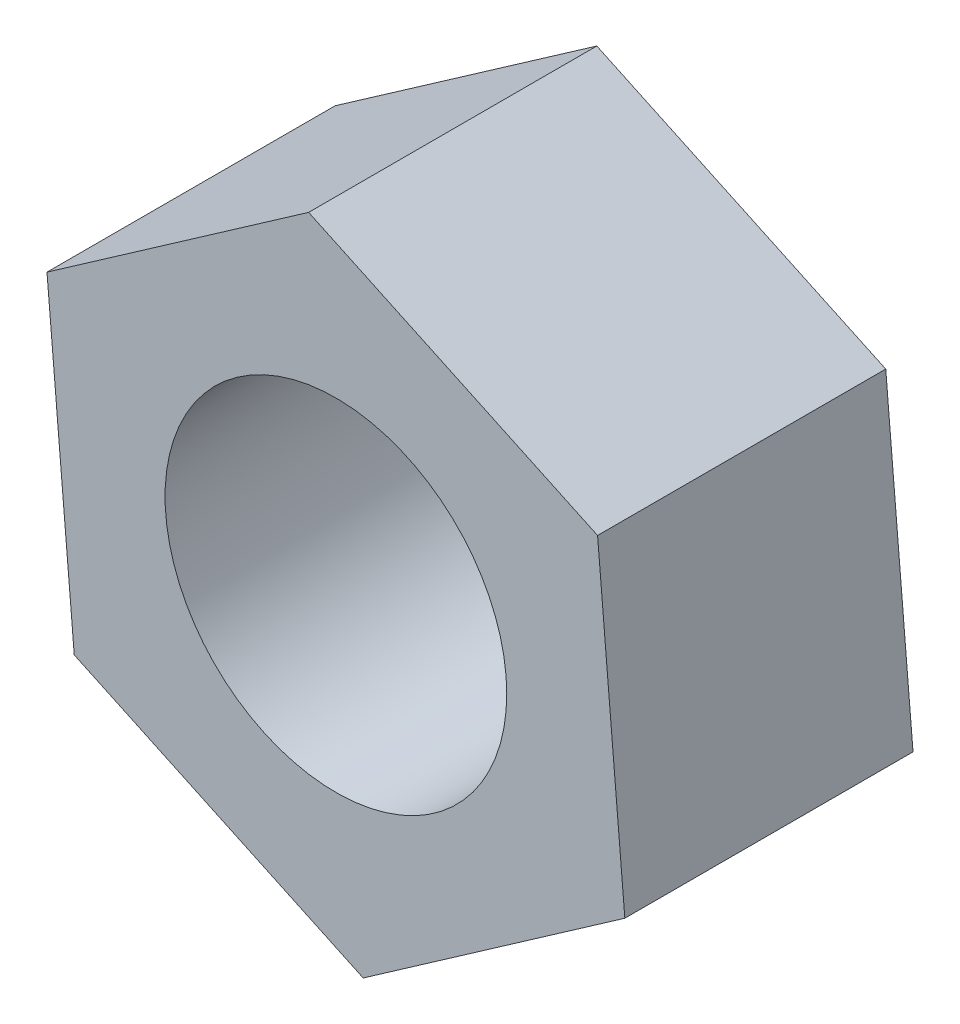
ISO-10303-21;
HEADER;
FILE_DESCRIPTION(('STEP AP214'),'2;1');
FILE_NAME('part.step','',(''),(''),'','','');
FILE_SCHEMA(('AUTOMOTIVE_DESIGN { 1 0 10303 214 1 1 1 1 }'));
ENDSEC;
DATA;
#1=APPLICATION_CONTEXT('core data for automotive mechanical design processes');
#2=APPLICATION_PROTOCOL_DEFINITION('international standard','automotive_design',2000,#1);
#3=PRODUCT_CONTEXT('',#1,'mechanical');
#4=PRODUCT('Part','Part','',(#3));
#5=PRODUCT_RELATED_PRODUCT_CATEGORY('part','',(#4));
#6=PRODUCT_DEFINITION_FORMATION('','',#4);
#7=PRODUCT_DEFINITION_CONTEXT('part definition',#1,'design');
#8=PRODUCT_DEFINITION('design','',#6,#7);
#9=PRODUCT_DEFINITION_SHAPE('','',#8);
#10=(LENGTH_UNIT() NAMED_UNIT(*) SI_UNIT(.MILLI.,.METRE.));
#11=(NAMED_UNIT(*) PLANE_ANGLE_UNIT() SI_UNIT($,.RADIAN.));
#12=(NAMED_UNIT(*) SI_UNIT($,.STERADIAN.) SOLID_ANGLE_UNIT());
#13=UNCERTAINTY_MEASURE_WITH_UNIT(LENGTH_MEASURE(1.E-05),#10,'distance_accuracy_value','');
#14=(GEOMETRIC_REPRESENTATION_CONTEXT(3) GLOBAL_UNCERTAINTY_ASSIGNED_CONTEXT((#13)) GLOBAL_UNIT_ASSIGNED_CONTEXT((#10,
#11,#12)) REPRESENTATION_CONTEXT('',''));
#15=CARTESIAN_POINT('',(0.,0.,0.));
#16=DIRECTION('',(0.,0.,1.));
#17=DIRECTION('',(1.,0.,0.));
#18=AXIS2_PLACEMENT_3D('',#15,#16,#17);
#19=CARTESIAN_POINT('',(-63.1293214477623,-11.1289207444886,10.));
#20=DIRECTION('',(0.,0.,1.));
#21=DIRECTION('',(1.,0.,0.));
#22=AXIS2_PLACEMENT_3D('',#19,#20,#21);
#23=PLANE('',#22);
#24=CARTESIAN_POINT('',(-15.0674842298031,-32.9075500518083,10.));
#25=DIRECTION('',(0.,0.,1.));
#26=DIRECTION('',(1.,0.,0.));
#27=AXIS2_PLACEMENT_3D('',#24,#25,#26);
#28=CIRCLE('',#27,4.15);
#29=CARTESIAN_POINT('',(-10.9174842298031,-32.9075500518083,10.));
#30=VERTEX_POINT('',#29);
#31=EDGE_CURVE('E11',#30,#30,#28,.T.);
#32=ORIENTED_EDGE('',*,*,#31,.T.);
#33=EDGE_LOOP('',(#32));
#34=FACE_BOUND('',#33,.T.);
#35=DIRECTION('',(-0.0855136291043812,0.996337000837266,0.));
#36=VECTOR('',#35,1.);
#37=CARTESIAN_POINT('',(-8.19005950123517,-34.5509822121306,10.));
#38=LINE('',#37,#36);
#39=CARTESIAN_POINT('',(-8.04900697774375,-36.1944143724528,10.));
#40=VERTEX_POINT('',#39);
#41=CARTESIAN_POINT('',(-8.71173760330268,-28.4728026159639,10.));
#42=VERTEX_POINT('',#41);
#43=EDGE_CURVE('E99',#40,#42,#38,.T.);
#44=ORIENTED_EDGE('',*,*,#43,.F.);
#45=DIRECTION('',(0.820096338903279,0.572225475592828,0.));
#46=VECTOR('',#45,1.);
#47=CARTESIAN_POINT('',(-11.226880290994,-38.411788090375,10.));
#48=LINE('',#47,#46);
#49=CARTESIAN_POINT('',(-14.4047536042442,-40.6291618082971,10.));
#50=VERTEX_POINT('',#49);
#51=EDGE_CURVE('E47',#50,#40,#48,.T.);
#52=ORIENTED_EDGE('',*,*,#51,.F.);
#53=DIRECTION('',(0.90560996800766,-0.424111525244439,0.));
#54=VECTOR('',#53,1.);
#55=CARTESIAN_POINT('',(-17.9139922302738,-38.9857296479749,10.));
#56=LINE('',#55,#54);
#57=CARTESIAN_POINT('',(-21.4232308563035,-37.3422974876528,10.));
#58=VERTEX_POINT('',#57);
#59=EDGE_CURVE('E134',#58,#50,#56,.T.);
#60=ORIENTED_EDGE('',*,*,#59,.F.);
#61=DIRECTION('',(0.0855136291043807,-0.996337000837266,0.));
#62=VECTOR('',#61,1.);
#63=CARTESIAN_POINT('',(-21.6135436455915,-35.1249237697305,10.));
#64=LINE('',#63,#62);
#65=CARTESIAN_POINT('',(-22.0859614818625,-29.6206857311639,10.));
#66=VERTEX_POINT('',#65);
#67=EDGE_CURVE('E120',#66,#58,#64,.T.);
#68=ORIENTED_EDGE('',*,*,#67,.F.);
#69=DIRECTION('',(-0.82009633890328,-0.572225475592827,0.));
#70=VECTOR('',#69,1.);
#71=CARTESIAN_POINT('',(-18.9080881686122,-27.4033120132418,10.));
#72=LINE('',#71,#70);
#73=CARTESIAN_POINT('',(-15.7302148553621,-25.1859382953196,10.));
#74=VERTEX_POINT('',#73);
#75=EDGE_CURVE('E115',#74,#66,#72,.T.);
#76=ORIENTED_EDGE('',*,*,#75,.F.);
#77=DIRECTION('',(-0.90560996800766,0.424111525244439,0.));
#78=VECTOR('',#77,1.);
#79=CARTESIAN_POINT('',(-12.2209762293324,-26.8293704556418,10.));
#80=LINE('',#79,#78);
#81=EDGE_CURVE('E103',#42,#74,#80,.T.);
#82=ORIENTED_EDGE('',*,*,#81,.F.);
#83=EDGE_LOOP('',(#44,#52,#60,#68,#76,#82));
#84=FACE_BOUND('',#83,.T.);
#85=ADVANCED_FACE('F17',(#34,#84),#23,.F.);
#86=CARTESIAN_POINT('',(-63.1293214477623,-11.1289207444886,17.));
#87=DIRECTION('',(0.,0.,1.));
#88=DIRECTION('',(1.,0.,0.));
#89=AXIS2_PLACEMENT_3D('',#86,#87,#88);
#90=PLANE('',#89);
#91=CARTESIAN_POINT('',(-15.0674842298031,-32.9075500518083,17.));
#92=DIRECTION('',(0.,0.,1.));
#93=DIRECTION('',(1.,0.,0.));
#94=AXIS2_PLACEMENT_3D('',#91,#92,#93);
#95=CIRCLE('',#94,4.15);
#96=CARTESIAN_POINT('',(-10.9174842298031,-32.9075500518083,17.));
#97=VERTEX_POINT('',#96);
#98=EDGE_CURVE('E25',#97,#97,#95,.T.);
#99=ORIENTED_EDGE('',*,*,#98,.F.);
#100=EDGE_LOOP('',(#99));
#101=FACE_BOUND('',#100,.T.);
#102=DIRECTION('',(-0.0855136291043812,0.996337000837266,0.));
#103=VECTOR('',#102,1.);
#104=CARTESIAN_POINT('',(-8.19005950123517,-34.5509822121306,17.));
#105=LINE('',#104,#103);
#106=CARTESIAN_POINT('',(-8.04900697774375,-36.1944143724528,17.));
#107=VERTEX_POINT('',#106);
#108=CARTESIAN_POINT('',(-8.71173760330268,-28.4728026159639,17.));
#109=VERTEX_POINT('',#108);
#110=EDGE_CURVE('E101',#107,#109,#105,.T.);
#111=ORIENTED_EDGE('',*,*,#110,.T.);
#112=DIRECTION('',(-0.90560996800766,0.424111525244439,0.));
#113=VECTOR('',#112,1.);
#114=CARTESIAN_POINT('',(-12.2209762293324,-26.8293704556418,17.));
#115=LINE('',#114,#113);
#116=CARTESIAN_POINT('',(-15.7302148553621,-25.1859382953196,17.));
#117=VERTEX_POINT('',#116);
#118=EDGE_CURVE('E118',#109,#117,#115,.T.);
#119=ORIENTED_EDGE('',*,*,#118,.T.);
#120=DIRECTION('',(-0.82009633890328,-0.572225475592827,0.));
#121=VECTOR('',#120,1.);
#122=CARTESIAN_POINT('',(-18.9080881686122,-27.4033120132418,17.));
#123=LINE('',#122,#121);
#124=CARTESIAN_POINT('',(-22.0859614818625,-29.6206857311639,17.));
#125=VERTEX_POINT('',#124);
#126=EDGE_CURVE('E125',#117,#125,#123,.T.);
#127=ORIENTED_EDGE('',*,*,#126,.T.);
#128=DIRECTION('',(0.0855136291043807,-0.996337000837266,0.));
#129=VECTOR('',#128,1.);
#130=CARTESIAN_POINT('',(-21.6135436455915,-35.1249237697305,17.));
#131=LINE('',#130,#129);
#132=CARTESIAN_POINT('',(-21.4232308563035,-37.3422974876528,17.));
#133=VERTEX_POINT('',#132);
#134=EDGE_CURVE('E137',#125,#133,#131,.T.);
#135=ORIENTED_EDGE('',*,*,#134,.T.);
#136=DIRECTION('',(0.90560996800766,-0.424111525244439,0.));
#137=VECTOR('',#136,1.);
#138=CARTESIAN_POINT('',(-17.9139922302738,-38.9857296479749,17.));
#139=LINE('',#138,#137);
#140=CARTESIAN_POINT('',(-14.4047536042442,-40.6291618082971,17.));
#141=VERTEX_POINT('',#140);
#142=EDGE_CURVE('E93',#133,#141,#139,.T.);
#143=ORIENTED_EDGE('',*,*,#142,.T.);
#144=DIRECTION('',(0.820096338903279,0.572225475592828,0.));
#145=VECTOR('',#144,1.);
#146=CARTESIAN_POINT('',(-11.226880290994,-38.411788090375,17.));
#147=LINE('',#146,#145);
#148=EDGE_CURVE('E37',#141,#107,#147,.T.);
#149=ORIENTED_EDGE('',*,*,#148,.T.);
#150=EDGE_LOOP('',(#111,#119,#127,#135,#143,#149));
#151=FACE_BOUND('',#150,.T.);
#152=ADVANCED_FACE('F165',(#101,#151),#90,.T.);
#153=CARTESIAN_POINT('',(-15.0674842298031,-32.9075500518083,17.));
#154=DIRECTION('',(0.,0.,-1.));
#155=DIRECTION('',(-1.,0.,0.));
#156=AXIS2_PLACEMENT_3D('',#153,#154,#155);
#157=CYLINDRICAL_SURFACE('',#156,4.15);
#158=ORIENTED_EDGE('',*,*,#31,.F.);
#159=EDGE_LOOP('',(#158));
#160=FACE_BOUND('',#159,.T.);
#161=ORIENTED_EDGE('',*,*,#98,.T.);
#162=EDGE_LOOP('',(#161));
#163=FACE_BOUND('',#162,.T.);
#164=ADVANCED_FACE('F163',(#160,#163),#157,.F.);
#165=CARTESIAN_POINT('',(-11.226880290994,-38.411788090375,17.));
#166=DIRECTION('',(-0.572225475592827,0.82009633890328,0.));
#167=DIRECTION('',(0.,0.,1.));
#168=AXIS2_PLACEMENT_3D('',#165,#166,#167);
#169=PLANE('',#168);
#170=ORIENTED_EDGE('',*,*,#51,.T.);
#171=DIRECTION('',(0.,0.,-1.));
#172=VECTOR('',#171,1.);
#173=CARTESIAN_POINT('',(-8.04900697774375,-36.1944143724528,17.));
#174=LINE('',#173,#172);
#175=EDGE_CURVE('E87',#107,#40,#174,.T.);
#176=ORIENTED_EDGE('',*,*,#175,.F.);
#177=ORIENTED_EDGE('',*,*,#148,.F.);
#178=DIRECTION('',(0.,0.,-1.));
#179=VECTOR('',#178,1.);
#180=CARTESIAN_POINT('',(-14.4047536042442,-40.6291618082971,17.));
#181=LINE('',#180,#179);
#182=EDGE_CURVE('E90',#141,#50,#181,.T.);
#183=ORIENTED_EDGE('',*,*,#182,.T.);
#184=EDGE_LOOP('',(#170,#176,#177,#183));
#185=FACE_BOUND('',#184,.T.);
#186=ADVANCED_FACE('F86',(#185),#169,.F.);
#187=CARTESIAN_POINT('',(-17.9139922302738,-38.9857296479749,17.));
#188=DIRECTION('',(0.424111525244439,0.90560996800766,0.));
#189=DIRECTION('',(0.,0.,-1.));
#190=AXIS2_PLACEMENT_3D('',#187,#188,#189);
#191=PLANE('',#190);
#192=ORIENTED_EDGE('',*,*,#59,.T.);
#193=ORIENTED_EDGE('',*,*,#182,.F.);
#194=ORIENTED_EDGE('',*,*,#142,.F.);
#195=DIRECTION('',(0.,0.,-1.));
#196=VECTOR('',#195,1.);
#197=CARTESIAN_POINT('',(-21.4232308563035,-37.3422974876528,17.));
#198=LINE('',#197,#196);
#199=EDGE_CURVE('E124',#133,#58,#198,.T.);
#200=ORIENTED_EDGE('',*,*,#199,.T.);
#201=EDGE_LOOP('',(#192,#193,#194,#200));
#202=FACE_BOUND('',#201,.T.);
#203=ADVANCED_FACE('F178',(#202),#191,.F.);
#204=CARTESIAN_POINT('',(-21.6135436455915,-35.1249237697305,17.));
#205=DIRECTION('',(0.996337000837266,0.0855136291043807,0.));
#206=DIRECTION('',(0.,0.,-1.));
#207=AXIS2_PLACEMENT_3D('',#204,#205,#206);
#208=PLANE('',#207);
#209=ORIENTED_EDGE('',*,*,#67,.T.);
#210=ORIENTED_EDGE('',*,*,#199,.F.);
#211=ORIENTED_EDGE('',*,*,#134,.F.);
#212=DIRECTION('',(0.,0.,-1.));
#213=VECTOR('',#212,1.);
#214=CARTESIAN_POINT('',(-22.0859614818625,-29.6206857311639,17.));
#215=LINE('',#214,#213);
#216=EDGE_CURVE('E117',#125,#66,#215,.T.);
#217=ORIENTED_EDGE('',*,*,#216,.T.);
#218=EDGE_LOOP('',(#209,#210,#211,#217));
#219=FACE_BOUND('',#218,.T.);
#220=ADVANCED_FACE('F176',(#219),#208,.F.);
#221=CARTESIAN_POINT('',(-18.9080881686122,-27.4033120132418,17.));
#222=DIRECTION('',(0.572225475592827,-0.82009633890328,0.));
#223=DIRECTION('',(0.,0.,-1.));
#224=AXIS2_PLACEMENT_3D('',#221,#222,#223);
#225=PLANE('',#224);
#226=ORIENTED_EDGE('',*,*,#75,.T.);
#227=ORIENTED_EDGE('',*,*,#216,.F.);
#228=ORIENTED_EDGE('',*,*,#126,.F.);
#229=DIRECTION('',(0.,0.,-1.));
#230=VECTOR('',#229,1.);
#231=CARTESIAN_POINT('',(-15.7302148553621,-25.1859382953196,17.));
#232=LINE('',#231,#230);
#233=EDGE_CURVE('E133',#117,#74,#232,.T.);
#234=ORIENTED_EDGE('',*,*,#233,.T.);
#235=EDGE_LOOP('',(#226,#227,#228,#234));
#236=FACE_BOUND('',#235,.T.);
#237=ADVANCED_FACE('F172',(#236),#225,.F.);
#238=CARTESIAN_POINT('',(-12.2209762293324,-26.8293704556418,17.));
#239=DIRECTION('',(-0.424111525244439,-0.90560996800766,0.));
#240=DIRECTION('',(-0.90560996800766,0.424111525244439,0.));
#241=AXIS2_PLACEMENT_3D('',#238,#239,#240);
#242=PLANE('',#241);
#243=ORIENTED_EDGE('',*,*,#81,.T.);
#244=ORIENTED_EDGE('',*,*,#233,.F.);
#245=ORIENTED_EDGE('',*,*,#118,.F.);
#246=DIRECTION('',(0.,0.,-1.));
#247=VECTOR('',#246,1.);
#248=CARTESIAN_POINT('',(-8.71173760330268,-28.4728026159639,17.));
#249=LINE('',#248,#247);
#250=EDGE_CURVE('E108',#109,#42,#249,.T.);
#251=ORIENTED_EDGE('',*,*,#250,.T.);
#252=EDGE_LOOP('',(#243,#244,#245,#251));
#253=FACE_BOUND('',#252,.T.);
#254=ADVANCED_FACE('F170',(#253),#242,.F.);
#255=CARTESIAN_POINT('',(-8.19005950123517,-34.5509822121306,17.));
#256=DIRECTION('',(-0.996337000837266,-0.0855136291043812,0.));
#257=DIRECTION('',(-0.0855136291043812,0.996337000837266,0.));
#258=AXIS2_PLACEMENT_3D('',#255,#256,#257);
#259=PLANE('',#258);
#260=ORIENTED_EDGE('',*,*,#43,.T.);
#261=ORIENTED_EDGE('',*,*,#250,.F.);
#262=ORIENTED_EDGE('',*,*,#110,.F.);
#263=ORIENTED_EDGE('',*,*,#175,.T.);
#264=EDGE_LOOP('',(#260,#261,#262,#263));
#265=FACE_BOUND('',#264,.T.);
#266=ADVANCED_FACE('F97',(#265),#259,.F.);
#267=CLOSED_SHELL('',(#85,#152,#164,#186,#203,#220,#237,#254,#266));
#268=MANIFOLD_SOLID_BREP('B1',#267);
#269=ADVANCED_BREP_SHAPE_REPRESENTATION('',(#18,#268),#14);
#270=SHAPE_DEFINITION_REPRESENTATION(#9,#269);
ENDSEC;
END-ISO-10303-21;
